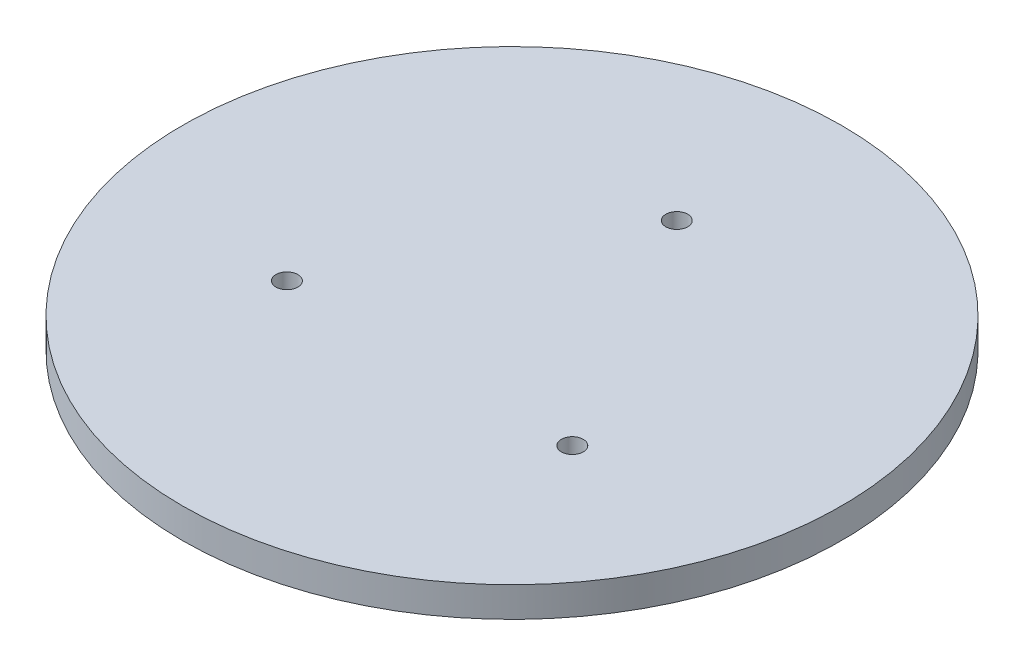
ISO-10303-21;
HEADER;
FILE_DESCRIPTION(('STEP AP214'),'2;1');
FILE_NAME('part.step','',(''),(''),'','','');
FILE_SCHEMA(('AUTOMOTIVE_DESIGN { 1 0 10303 214 1 1 1 1 }'));
ENDSEC;
DATA;
#1=APPLICATION_CONTEXT('core data for automotive mechanical design processes');
#2=APPLICATION_PROTOCOL_DEFINITION('international standard','automotive_design',2000,#1);
#3=PRODUCT_CONTEXT('',#1,'mechanical');
#4=PRODUCT('Part','Part','',(#3));
#5=PRODUCT_RELATED_PRODUCT_CATEGORY('part','',(#4));
#6=PRODUCT_DEFINITION_FORMATION('','',#4);
#7=PRODUCT_DEFINITION_CONTEXT('part definition',#1,'design');
#8=PRODUCT_DEFINITION('design','',#6,#7);
#9=PRODUCT_DEFINITION_SHAPE('','',#8);
#10=(LENGTH_UNIT() NAMED_UNIT(*) SI_UNIT(.MILLI.,.METRE.));
#11=(NAMED_UNIT(*) PLANE_ANGLE_UNIT() SI_UNIT($,.RADIAN.));
#12=(NAMED_UNIT(*) SI_UNIT($,.STERADIAN.) SOLID_ANGLE_UNIT());
#13=UNCERTAINTY_MEASURE_WITH_UNIT(LENGTH_MEASURE(1.E-05),#10,'distance_accuracy_value','');
#14=(GEOMETRIC_REPRESENTATION_CONTEXT(3) GLOBAL_UNCERTAINTY_ASSIGNED_CONTEXT((#13)) GLOBAL_UNIT_ASSIGNED_CONTEXT((#10,
#11,#12)) REPRESENTATION_CONTEXT('',''));
#15=CARTESIAN_POINT('',(0.,0.,0.));
#16=DIRECTION('',(0.,0.,1.));
#17=DIRECTION('',(1.,0.,0.));
#18=AXIS2_PLACEMENT_3D('',#15,#16,#17);
#19=CARTESIAN_POINT('',(0.,6.35,0.));
#20=DIRECTION('',(0.,1.,0.));
#21=DIRECTION('',(0.,0.,1.));
#22=AXIS2_PLACEMENT_3D('',#19,#20,#21);
#23=PLANE('',#22);
#24=CARTESIAN_POINT('',(30.1359520008909,6.35,17.399));
#25=DIRECTION('',(0.,1.,0.));
#26=DIRECTION('',(0.,0.,1.));
#27=AXIS2_PLACEMENT_3D('',#24,#25,#26);
#28=CIRCLE('',#27,2.3114);
#29=CARTESIAN_POINT('',(30.1359520008909,6.35,19.7104));
#30=VERTEX_POINT('',#29);
#31=EDGE_CURVE('E47',#30,#30,#28,.T.);
#32=ORIENTED_EDGE('',*,*,#31,.F.);
#33=EDGE_LOOP('',(#32));
#34=FACE_BOUND('',#33,.T.);
#35=CARTESIAN_POINT('',(0.,6.35,0.));
#36=DIRECTION('',(0.,1.,0.));
#37=DIRECTION('',(0.,0.,1.));
#38=AXIS2_PLACEMENT_3D('',#35,#36,#37);
#39=CIRCLE('',#38,69.596);
#40=CARTESIAN_POINT('',(0.,6.35,69.596));
#41=VERTEX_POINT('',#40);
#42=EDGE_CURVE('E10',#41,#41,#39,.T.);
#43=ORIENTED_EDGE('',*,*,#42,.T.);
#44=EDGE_LOOP('',(#43));
#45=FACE_BOUND('',#44,.T.);
#46=CARTESIAN_POINT('',(0.,6.35,-34.798));
#47=DIRECTION('',(0.,1.,0.));
#48=DIRECTION('',(0.,0.,1.));
#49=AXIS2_PLACEMENT_3D('',#46,#47,#48);
#50=CIRCLE('',#49,2.3114);
#51=CARTESIAN_POINT('',(0.,6.35,-32.4866));
#52=VERTEX_POINT('',#51);
#53=EDGE_CURVE('E42',#52,#52,#50,.T.);
#54=ORIENTED_EDGE('',*,*,#53,.F.);
#55=EDGE_LOOP('',(#54));
#56=FACE_BOUND('',#55,.T.);
#57=CARTESIAN_POINT('',(-30.1359520008909,6.35,17.399));
#58=DIRECTION('',(0.,1.,0.));
#59=DIRECTION('',(0.,0.,1.));
#60=AXIS2_PLACEMENT_3D('',#57,#58,#59);
#61=CIRCLE('',#60,2.3114);
#62=CARTESIAN_POINT('',(-30.1359520008909,6.35,19.7104));
#63=VERTEX_POINT('',#62);
#64=EDGE_CURVE('E53',#63,#63,#61,.T.);
#65=ORIENTED_EDGE('',*,*,#64,.F.);
#66=EDGE_LOOP('',(#65));
#67=FACE_BOUND('',#66,.T.);
#68=ADVANCED_FACE('F31',(#34,#45,#56,#67),#23,.T.);
#69=CARTESIAN_POINT('',(0.,0.,0.));
#70=DIRECTION('',(0.,1.,0.));
#71=DIRECTION('',(0.,0.,1.));
#72=AXIS2_PLACEMENT_3D('',#69,#70,#71);
#73=PLANE('',#72);
#74=CARTESIAN_POINT('',(30.1359520008909,0.,17.399));
#75=DIRECTION('',(0.,1.,0.));
#76=DIRECTION('',(0.,0.,1.));
#77=AXIS2_PLACEMENT_3D('',#74,#75,#76);
#78=CIRCLE('',#77,2.3114);
#79=CARTESIAN_POINT('',(30.1359520008909,0.,19.7104));
#80=VERTEX_POINT('',#79);
#81=EDGE_CURVE('E50',#80,#80,#78,.T.);
#82=ORIENTED_EDGE('',*,*,#81,.T.);
#83=EDGE_LOOP('',(#82));
#84=FACE_BOUND('',#83,.T.);
#85=CARTESIAN_POINT('',(0.,0.,0.));
#86=DIRECTION('',(0.,1.,0.));
#87=DIRECTION('',(0.,0.,1.));
#88=AXIS2_PLACEMENT_3D('',#85,#86,#87);
#89=CIRCLE('',#88,69.596);
#90=CARTESIAN_POINT('',(0.,0.,69.596));
#91=VERTEX_POINT('',#90);
#92=EDGE_CURVE('E35',#91,#91,#89,.T.);
#93=ORIENTED_EDGE('',*,*,#92,.F.);
#94=EDGE_LOOP('',(#93));
#95=FACE_BOUND('',#94,.T.);
#96=CARTESIAN_POINT('',(0.,0.,-34.798));
#97=DIRECTION('',(0.,1.,0.));
#98=DIRECTION('',(0.,0.,1.));
#99=AXIS2_PLACEMENT_3D('',#96,#97,#98);
#100=CIRCLE('',#99,2.3114);
#101=CARTESIAN_POINT('',(0.,0.,-32.4866));
#102=VERTEX_POINT('',#101);
#103=EDGE_CURVE('E44',#102,#102,#100,.T.);
#104=ORIENTED_EDGE('',*,*,#103,.T.);
#105=EDGE_LOOP('',(#104));
#106=FACE_BOUND('',#105,.T.);
#107=CARTESIAN_POINT('',(-30.1359520008909,0.,17.399));
#108=DIRECTION('',(0.,1.,0.));
#109=DIRECTION('',(0.,0.,1.));
#110=AXIS2_PLACEMENT_3D('',#107,#108,#109);
#111=CIRCLE('',#110,2.3114);
#112=CARTESIAN_POINT('',(-30.1359520008909,0.,19.7104));
#113=VERTEX_POINT('',#112);
#114=EDGE_CURVE('E56',#113,#113,#111,.T.);
#115=ORIENTED_EDGE('',*,*,#114,.T.);
#116=EDGE_LOOP('',(#115));
#117=FACE_BOUND('',#116,.T.);
#118=ADVANCED_FACE('F66',(#84,#95,#106,#117),#73,.F.);
#119=CARTESIAN_POINT('',(0.,6.35,0.));
#120=DIRECTION('',(0.,-1.,0.));
#121=DIRECTION('',(0.,0.,-1.));
#122=AXIS2_PLACEMENT_3D('',#119,#120,#121);
#123=CYLINDRICAL_SURFACE('',#122,69.596);
#124=ORIENTED_EDGE('',*,*,#42,.F.);
#125=EDGE_LOOP('',(#124));
#126=FACE_BOUND('',#125,.T.);
#127=ORIENTED_EDGE('',*,*,#92,.T.);
#128=EDGE_LOOP('',(#127));
#129=FACE_BOUND('',#128,.T.);
#130=ADVANCED_FACE('F33',(#126,#129),#123,.T.);
#131=CARTESIAN_POINT('',(0.,6.35,-34.798));
#132=DIRECTION('',(0.,-1.,0.));
#133=DIRECTION('',(0.,0.,-1.));
#134=AXIS2_PLACEMENT_3D('',#131,#132,#133);
#135=CYLINDRICAL_SURFACE('',#134,2.3114);
#136=ORIENTED_EDGE('',*,*,#53,.T.);
#137=EDGE_LOOP('',(#136));
#138=FACE_BOUND('',#137,.T.);
#139=ORIENTED_EDGE('',*,*,#103,.F.);
#140=EDGE_LOOP('',(#139));
#141=FACE_BOUND('',#140,.T.);
#142=ADVANCED_FACE('F75',(#138,#141),#135,.F.);
#143=CARTESIAN_POINT('',(30.1359520008909,6.35,17.399));
#144=DIRECTION('',(0.,-1.,0.));
#145=DIRECTION('',(0.,0.,-1.));
#146=AXIS2_PLACEMENT_3D('',#143,#144,#145);
#147=CYLINDRICAL_SURFACE('',#146,2.3114);
#148=ORIENTED_EDGE('',*,*,#31,.T.);
#149=EDGE_LOOP('',(#148));
#150=FACE_BOUND('',#149,.T.);
#151=ORIENTED_EDGE('',*,*,#81,.F.);
#152=EDGE_LOOP('',(#151));
#153=FACE_BOUND('',#152,.T.);
#154=ADVANCED_FACE('F78',(#150,#153),#147,.F.);
#155=CARTESIAN_POINT('',(-30.1359520008909,6.35,17.399));
#156=DIRECTION('',(0.,-1.,0.));
#157=DIRECTION('',(0.,0.,-1.));
#158=AXIS2_PLACEMENT_3D('',#155,#156,#157);
#159=CYLINDRICAL_SURFACE('',#158,2.3114);
#160=ORIENTED_EDGE('',*,*,#64,.T.);
#161=EDGE_LOOP('',(#160));
#162=FACE_BOUND('',#161,.T.);
#163=ORIENTED_EDGE('',*,*,#114,.F.);
#164=EDGE_LOOP('',(#163));
#165=FACE_BOUND('',#164,.T.);
#166=ADVANCED_FACE('F62',(#162,#165),#159,.F.);
#167=CLOSED_SHELL('',(#68,#118,#130,#142,#154,#166));
#168=MANIFOLD_SOLID_BREP('B2',#167);
#169=ADVANCED_BREP_SHAPE_REPRESENTATION('',(#18,#168),#14);
#170=SHAPE_DEFINITION_REPRESENTATION(#9,#169);
ENDSEC;
END-ISO-10303-21;
